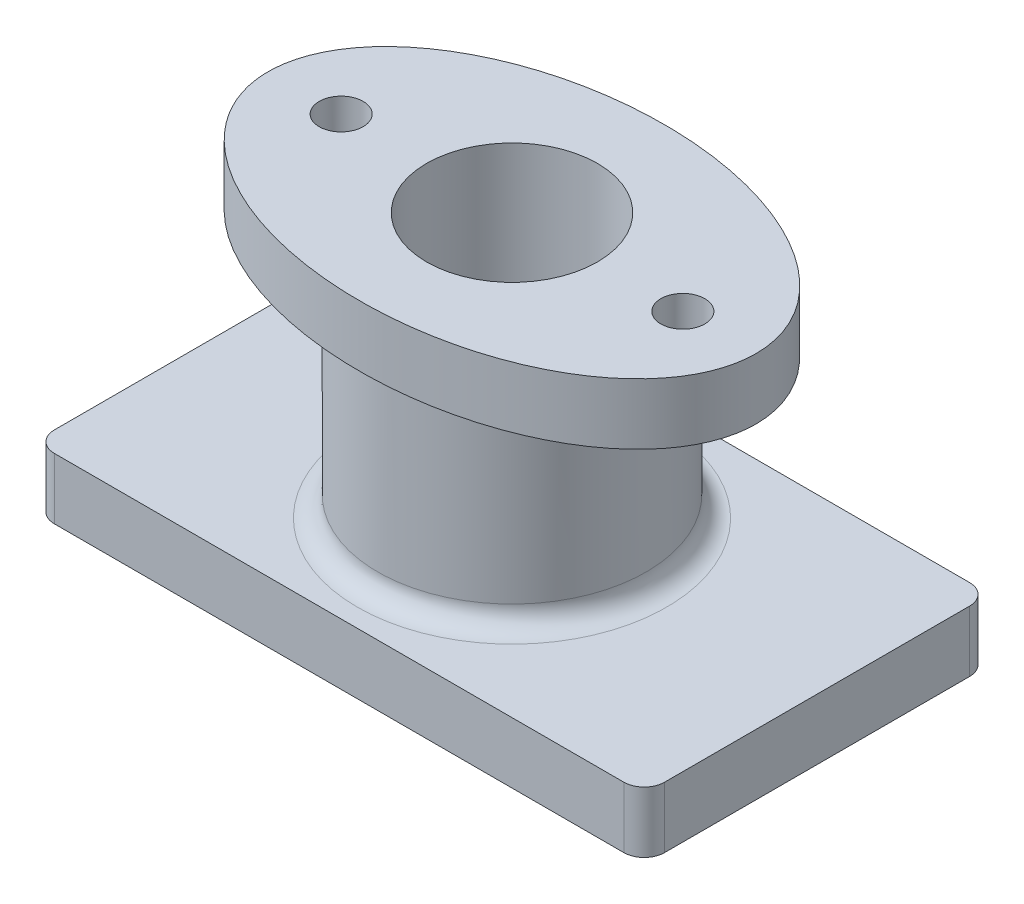
ISO-10303-21;
HEADER;
FILE_DESCRIPTION(('STEP AP214'),'2;1');
FILE_NAME('part.step','',(''),(''),'','','');
FILE_SCHEMA(('AUTOMOTIVE_DESIGN { 1 0 10303 214 1 1 1 1 }'));
ENDSEC;
DATA;
#1=APPLICATION_CONTEXT('core data for automotive mechanical design processes');
#2=APPLICATION_PROTOCOL_DEFINITION('international standard','automotive_design',2000,#1);
#3=PRODUCT_CONTEXT('',#1,'mechanical');
#4=PRODUCT('Part','Part','',(#3));
#5=PRODUCT_RELATED_PRODUCT_CATEGORY('part','',(#4));
#6=PRODUCT_DEFINITION_FORMATION('','',#4);
#7=PRODUCT_DEFINITION_CONTEXT('part definition',#1,'design');
#8=PRODUCT_DEFINITION('design','',#6,#7);
#9=PRODUCT_DEFINITION_SHAPE('','',#8);
#10=(LENGTH_UNIT() NAMED_UNIT(*) SI_UNIT(.MILLI.,.METRE.));
#11=(NAMED_UNIT(*) PLANE_ANGLE_UNIT() SI_UNIT($,.RADIAN.));
#12=(NAMED_UNIT(*) SI_UNIT($,.STERADIAN.) SOLID_ANGLE_UNIT());
#13=UNCERTAINTY_MEASURE_WITH_UNIT(LENGTH_MEASURE(1.E-05),#10,'distance_accuracy_value','');
#14=(GEOMETRIC_REPRESENTATION_CONTEXT(3) GLOBAL_UNCERTAINTY_ASSIGNED_CONTEXT((#13)) GLOBAL_UNIT_ASSIGNED_CONTEXT((#10,
#11,#12)) REPRESENTATION_CONTEXT('',''));
#15=CARTESIAN_POINT('',(0.,0.,0.));
#16=DIRECTION('',(0.,0.,1.));
#17=DIRECTION('',(1.,0.,0.));
#18=AXIS2_PLACEMENT_3D('',#15,#16,#17);
#19=CARTESIAN_POINT('',(-70.,15.,37.5));
#20=DIRECTION('',(0.,-1.,0.));
#21=DIRECTION('',(0.,0.,-1.));
#22=AXIS2_PLACEMENT_3D('',#19,#20,#21);
#23=CYLINDRICAL_SURFACE('',#22,5.);
#24=CARTESIAN_POINT('',(-70.,0.,37.5));
#25=DIRECTION('',(0.,1.,0.));
#26=DIRECTION('',(0.,0.,-1.));
#27=AXIS2_PLACEMENT_3D('',#24,#25,#26);
#28=CIRCLE('',#27,5.);
#29=CARTESIAN_POINT('',(-75.,0.,37.5));
#30=VERTEX_POINT('',#29);
#31=CARTESIAN_POINT('',(-70.,0.,42.5));
#32=VERTEX_POINT('',#31);
#33=EDGE_CURVE('E133',#30,#32,#28,.T.);
#34=ORIENTED_EDGE('',*,*,#33,.T.);
#35=DIRECTION('',(0.,-1.,0.));
#36=VECTOR('',#35,1.);
#37=CARTESIAN_POINT('',(-70.,15.,42.5));
#38=LINE('',#37,#36);
#39=CARTESIAN_POINT('',(-70.,15.,42.5));
#40=VERTEX_POINT('',#39);
#41=EDGE_CURVE('E161',#40,#32,#38,.T.);
#42=ORIENTED_EDGE('',*,*,#41,.F.);
#43=CARTESIAN_POINT('',(-70.,15.,37.5));
#44=DIRECTION('',(0.,1.,0.));
#45=DIRECTION('',(0.,0.,-1.));
#46=AXIS2_PLACEMENT_3D('',#43,#44,#45);
#47=CIRCLE('',#46,5.);
#48=CARTESIAN_POINT('',(-75.,15.,37.5));
#49=VERTEX_POINT('',#48);
#50=EDGE_CURVE('E148',#49,#40,#47,.T.);
#51=ORIENTED_EDGE('',*,*,#50,.F.);
#52=DIRECTION('',(0.,-1.,0.));
#53=VECTOR('',#52,1.);
#54=CARTESIAN_POINT('',(-75.,15.,37.5));
#55=LINE('',#54,#53);
#56=EDGE_CURVE('E129',#49,#30,#55,.T.);
#57=ORIENTED_EDGE('',*,*,#56,.T.);
#58=EDGE_LOOP('',(#34,#42,#51,#57));
#59=FACE_BOUND('',#58,.T.);
#60=ADVANCED_FACE('F35',(#59),#23,.T.);
#61=CARTESIAN_POINT('',(-70.,15.,42.5));
#62=DIRECTION('',(0.,0.,-1.));
#63=DIRECTION('',(-1.,0.,0.));
#64=AXIS2_PLACEMENT_3D('',#61,#62,#63);
#65=PLANE('',#64);
#66=DIRECTION('',(1.,0.,0.));
#67=VECTOR('',#66,1.);
#68=CARTESIAN_POINT('',(-70.,0.,42.5));
#69=LINE('',#68,#67);
#70=CARTESIAN_POINT('',(70.,0.,42.5));
#71=VERTEX_POINT('',#70);
#72=EDGE_CURVE('E136',#32,#71,#69,.T.);
#73=ORIENTED_EDGE('',*,*,#72,.T.);
#74=DIRECTION('',(0.,-1.,0.));
#75=VECTOR('',#74,1.);
#76=CARTESIAN_POINT('',(70.,15.,42.5));
#77=LINE('',#76,#75);
#78=CARTESIAN_POINT('',(70.,15.,42.5));
#79=VERTEX_POINT('',#78);
#80=EDGE_CURVE('E158',#79,#71,#77,.T.);
#81=ORIENTED_EDGE('',*,*,#80,.F.);
#82=DIRECTION('',(1.,0.,0.));
#83=VECTOR('',#82,1.);
#84=CARTESIAN_POINT('',(-70.,15.,42.5));
#85=LINE('',#84,#83);
#86=EDGE_CURVE('E96',#40,#79,#85,.T.);
#87=ORIENTED_EDGE('',*,*,#86,.F.);
#88=ORIENTED_EDGE('',*,*,#41,.T.);
#89=EDGE_LOOP('',(#73,#81,#87,#88));
#90=FACE_BOUND('',#89,.T.);
#91=ADVANCED_FACE('F179',(#90),#65,.F.);
#92=CARTESIAN_POINT('',(70.,15.,37.5));
#93=DIRECTION('',(0.,-1.,0.));
#94=DIRECTION('',(0.,0.,-1.));
#95=AXIS2_PLACEMENT_3D('',#92,#93,#94);
#96=CYLINDRICAL_SURFACE('',#95,5.);
#97=CARTESIAN_POINT('',(70.,0.,37.5));
#98=DIRECTION('',(0.,1.,0.));
#99=DIRECTION('',(0.,0.,1.));
#100=AXIS2_PLACEMENT_3D('',#97,#98,#99);
#101=CIRCLE('',#100,5.);
#102=CARTESIAN_POINT('',(75.,0.,37.5));
#103=VERTEX_POINT('',#102);
#104=EDGE_CURVE('E139',#71,#103,#101,.T.);
#105=ORIENTED_EDGE('',*,*,#104,.T.);
#106=DIRECTION('',(0.,-1.,0.));
#107=VECTOR('',#106,1.);
#108=CARTESIAN_POINT('',(75.,15.,37.5));
#109=LINE('',#108,#107);
#110=CARTESIAN_POINT('',(75.,15.,37.5));
#111=VERTEX_POINT('',#110);
#112=EDGE_CURVE('E155',#111,#103,#109,.T.);
#113=ORIENTED_EDGE('',*,*,#112,.F.);
#114=CARTESIAN_POINT('',(70.,15.,37.5));
#115=DIRECTION('',(0.,1.,0.));
#116=DIRECTION('',(0.,0.,1.));
#117=AXIS2_PLACEMENT_3D('',#114,#115,#116);
#118=CIRCLE('',#117,5.);
#119=EDGE_CURVE('E237',#79,#111,#118,.T.);
#120=ORIENTED_EDGE('',*,*,#119,.F.);
#121=ORIENTED_EDGE('',*,*,#80,.T.);
#122=EDGE_LOOP('',(#105,#113,#120,#121));
#123=FACE_BOUND('',#122,.T.);
#124=ADVANCED_FACE('F184',(#123),#96,.T.);
#125=CARTESIAN_POINT('',(75.,15.,37.5));
#126=DIRECTION('',(-1.,0.,0.));
#127=DIRECTION('',(0.,0.,1.));
#128=AXIS2_PLACEMENT_3D('',#125,#126,#127);
#129=PLANE('',#128);
#130=DIRECTION('',(0.,0.,-1.));
#131=VECTOR('',#130,1.);
#132=CARTESIAN_POINT('',(75.,0.,37.5));
#133=LINE('',#132,#131);
#134=CARTESIAN_POINT('',(75.,0.,-37.5));
#135=VERTEX_POINT('',#134);
#136=EDGE_CURVE('E141',#103,#135,#133,.T.);
#137=ORIENTED_EDGE('',*,*,#136,.T.);
#138=DIRECTION('',(0.,-1.,0.));
#139=VECTOR('',#138,1.);
#140=CARTESIAN_POINT('',(75.,15.,-37.5));
#141=LINE('',#140,#139);
#142=CARTESIAN_POINT('',(75.,15.,-37.5));
#143=VERTEX_POINT('',#142);
#144=EDGE_CURVE('E152',#143,#135,#141,.T.);
#145=ORIENTED_EDGE('',*,*,#144,.F.);
#146=DIRECTION('',(0.,0.,-1.));
#147=VECTOR('',#146,1.);
#148=CARTESIAN_POINT('',(75.,15.,37.5));
#149=LINE('',#148,#147);
#150=EDGE_CURVE('E239',#111,#143,#149,.T.);
#151=ORIENTED_EDGE('',*,*,#150,.F.);
#152=ORIENTED_EDGE('',*,*,#112,.T.);
#153=EDGE_LOOP('',(#137,#145,#151,#152));
#154=FACE_BOUND('',#153,.T.);
#155=ADVANCED_FACE('F189',(#154),#129,.F.);
#156=CARTESIAN_POINT('',(70.,15.,-37.5));
#157=DIRECTION('',(0.,-1.,0.));
#158=DIRECTION('',(0.,0.,-1.));
#159=AXIS2_PLACEMENT_3D('',#156,#157,#158);
#160=CYLINDRICAL_SURFACE('',#159,5.);
#161=CARTESIAN_POINT('',(70.,0.,-37.5));
#162=DIRECTION('',(0.,1.,0.));
#163=DIRECTION('',(0.,0.,-1.));
#164=AXIS2_PLACEMENT_3D('',#161,#162,#163);
#165=CIRCLE('',#164,5.);
#166=CARTESIAN_POINT('',(70.,0.,-42.5));
#167=VERTEX_POINT('',#166);
#168=EDGE_CURVE('E143',#135,#167,#165,.T.);
#169=ORIENTED_EDGE('',*,*,#168,.T.);
#170=DIRECTION('',(0.,-1.,0.));
#171=VECTOR('',#170,1.);
#172=CARTESIAN_POINT('',(70.,15.,-42.5));
#173=LINE('',#172,#171);
#174=CARTESIAN_POINT('',(70.,15.,-42.5));
#175=VERTEX_POINT('',#174);
#176=EDGE_CURVE('E124',#175,#167,#173,.T.);
#177=ORIENTED_EDGE('',*,*,#176,.F.);
#178=CARTESIAN_POINT('',(70.,15.,-37.5));
#179=DIRECTION('',(0.,1.,0.));
#180=DIRECTION('',(0.,0.,-1.));
#181=AXIS2_PLACEMENT_3D('',#178,#179,#180);
#182=CIRCLE('',#181,5.);
#183=EDGE_CURVE('E115',#143,#175,#182,.T.);
#184=ORIENTED_EDGE('',*,*,#183,.F.);
#185=ORIENTED_EDGE('',*,*,#144,.T.);
#186=EDGE_LOOP('',(#169,#177,#184,#185));
#187=FACE_BOUND('',#186,.T.);
#188=ADVANCED_FACE('F193',(#187),#160,.T.);
#189=CARTESIAN_POINT('',(-70.,15.,-42.5));
#190=DIRECTION('',(0.,0.,1.));
#191=DIRECTION('',(1.,0.,0.));
#192=AXIS2_PLACEMENT_3D('',#189,#190,#191);
#193=PLANE('',#192);
#194=DIRECTION('',(-1.,0.,0.));
#195=VECTOR('',#194,1.);
#196=CARTESIAN_POINT('',(-70.,0.,-42.5));
#197=LINE('',#196,#195);
#198=CARTESIAN_POINT('',(-70.,0.,-42.5));
#199=VERTEX_POINT('',#198);
#200=EDGE_CURVE('E123',#167,#199,#197,.T.);
#201=ORIENTED_EDGE('',*,*,#200,.T.);
#202=DIRECTION('',(0.,-1.,0.));
#203=VECTOR('',#202,1.);
#204=CARTESIAN_POINT('',(-70.,15.,-42.5));
#205=LINE('',#204,#203);
#206=CARTESIAN_POINT('',(-70.,15.,-42.5));
#207=VERTEX_POINT('',#206);
#208=EDGE_CURVE('E120',#207,#199,#205,.T.);
#209=ORIENTED_EDGE('',*,*,#208,.F.);
#210=DIRECTION('',(-1.,0.,0.));
#211=VECTOR('',#210,1.);
#212=CARTESIAN_POINT('',(-70.,15.,-42.5));
#213=LINE('',#212,#211);
#214=EDGE_CURVE('E109',#175,#207,#213,.T.);
#215=ORIENTED_EDGE('',*,*,#214,.F.);
#216=ORIENTED_EDGE('',*,*,#176,.T.);
#217=EDGE_LOOP('',(#201,#209,#215,#216));
#218=FACE_BOUND('',#217,.T.);
#219=ADVANCED_FACE('F121',(#218),#193,.F.);
#220=CARTESIAN_POINT('',(-70.,15.,-37.5));
#221=DIRECTION('',(0.,-1.,0.));
#222=DIRECTION('',(0.,0.,-1.));
#223=AXIS2_PLACEMENT_3D('',#220,#221,#222);
#224=CYLINDRICAL_SURFACE('',#223,5.);
#225=CARTESIAN_POINT('',(-70.,0.,-37.5));
#226=DIRECTION('',(0.,1.,0.));
#227=DIRECTION('',(0.,0.,-1.));
#228=AXIS2_PLACEMENT_3D('',#225,#226,#227);
#229=CIRCLE('',#228,5.);
#230=CARTESIAN_POINT('',(-75.,0.,-37.5));
#231=VERTEX_POINT('',#230);
#232=EDGE_CURVE('E81',#199,#231,#229,.T.);
#233=ORIENTED_EDGE('',*,*,#232,.T.);
#234=DIRECTION('',(0.,-1.,0.));
#235=VECTOR('',#234,1.);
#236=CARTESIAN_POINT('',(-75.,15.,-37.5));
#237=LINE('',#236,#235);
#238=CARTESIAN_POINT('',(-75.,15.,-37.5));
#239=VERTEX_POINT('',#238);
#240=EDGE_CURVE('E125',#239,#231,#237,.T.);
#241=ORIENTED_EDGE('',*,*,#240,.F.);
#242=CARTESIAN_POINT('',(-70.,15.,-37.5));
#243=DIRECTION('',(0.,1.,0.));
#244=DIRECTION('',(0.,0.,-1.));
#245=AXIS2_PLACEMENT_3D('',#242,#243,#244);
#246=CIRCLE('',#245,5.);
#247=EDGE_CURVE('E113',#207,#239,#246,.T.);
#248=ORIENTED_EDGE('',*,*,#247,.F.);
#249=ORIENTED_EDGE('',*,*,#208,.T.);
#250=EDGE_LOOP('',(#233,#241,#248,#249));
#251=FACE_BOUND('',#250,.T.);
#252=ADVANCED_FACE('F127',(#251),#224,.T.);
#253=CARTESIAN_POINT('',(-75.,15.,37.5));
#254=DIRECTION('',(1.,0.,0.));
#255=DIRECTION('',(0.,0.,-1.));
#256=AXIS2_PLACEMENT_3D('',#253,#254,#255);
#257=PLANE('',#256);
#258=DIRECTION('',(0.,0.,1.));
#259=VECTOR('',#258,1.);
#260=CARTESIAN_POINT('',(-75.,0.,37.5));
#261=LINE('',#260,#259);
#262=EDGE_CURVE('E87',#231,#30,#261,.T.);
#263=ORIENTED_EDGE('',*,*,#262,.T.);
#264=ORIENTED_EDGE('',*,*,#56,.F.);
#265=DIRECTION('',(0.,0.,1.));
#266=VECTOR('',#265,1.);
#267=CARTESIAN_POINT('',(-75.,15.,37.5));
#268=LINE('',#267,#266);
#269=EDGE_CURVE('E52',#239,#49,#268,.T.);
#270=ORIENTED_EDGE('',*,*,#269,.F.);
#271=ORIENTED_EDGE('',*,*,#240,.T.);
#272=EDGE_LOOP('',(#263,#264,#270,#271));
#273=FACE_BOUND('',#272,.T.);
#274=ADVANCED_FACE('F202',(#273),#257,.F.);
#275=CARTESIAN_POINT('',(-70.,15.,37.5));
#276=DIRECTION('',(0.,-1.,0.));
#277=DIRECTION('',(0.,0.,-1.));
#278=AXIS2_PLACEMENT_3D('',#275,#276,#277);
#279=PLANE('',#278);
#280=CARTESIAN_POINT('',(0.,15.,0.));
#281=DIRECTION('',(0.,-1.,0.));
#282=DIRECTION('',(0.,0.,-1.));
#283=AXIS2_PLACEMENT_3D('',#280,#281,#282);
#284=CIRCLE('',#283,38.);
#285=CARTESIAN_POINT('',(0.,15.,-38.));
#286=VERTEX_POINT('',#285);
#287=EDGE_CURVE('E11',#286,#286,#284,.T.);
#288=ORIENTED_EDGE('',*,*,#287,.T.);
#289=EDGE_LOOP('',(#288));
#290=FACE_BOUND('',#289,.T.);
#291=ORIENTED_EDGE('',*,*,#50,.T.);
#292=ORIENTED_EDGE('',*,*,#86,.T.);
#293=ORIENTED_EDGE('',*,*,#119,.T.);
#294=ORIENTED_EDGE('',*,*,#150,.T.);
#295=ORIENTED_EDGE('',*,*,#183,.T.);
#296=ORIENTED_EDGE('',*,*,#214,.T.);
#297=ORIENTED_EDGE('',*,*,#247,.T.);
#298=ORIENTED_EDGE('',*,*,#269,.T.);
#299=EDGE_LOOP('',(#291,#292,#293,#294,#295,#296,#297,#298));
#300=FACE_BOUND('',#299,.T.);
#301=ADVANCED_FACE('F111',(#290,#300),#279,.F.);
#302=CARTESIAN_POINT('',(-70.,0.,37.5));
#303=DIRECTION('',(0.,-1.,0.));
#304=DIRECTION('',(0.,0.,-1.));
#305=AXIS2_PLACEMENT_3D('',#302,#303,#304);
#306=PLANE('',#305);
#307=CARTESIAN_POINT('',(0.,0.,0.));
#308=DIRECTION('',(0.,-1.,0.));
#309=DIRECTION('',(0.,0.,-1.));
#310=AXIS2_PLACEMENT_3D('',#307,#308,#309);
#311=CIRCLE('',#310,16.5);
#312=CARTESIAN_POINT('',(0.,0.,-16.5));
#313=VERTEX_POINT('',#312);
#314=EDGE_CURVE('E284',#313,#313,#311,.T.);
#315=ORIENTED_EDGE('',*,*,#314,.F.);
#316=EDGE_LOOP('',(#315));
#317=FACE_BOUND('',#316,.T.);
#318=ORIENTED_EDGE('',*,*,#33,.F.);
#319=ORIENTED_EDGE('',*,*,#262,.F.);
#320=ORIENTED_EDGE('',*,*,#232,.F.);
#321=ORIENTED_EDGE('',*,*,#200,.F.);
#322=ORIENTED_EDGE('',*,*,#168,.F.);
#323=ORIENTED_EDGE('',*,*,#136,.F.);
#324=ORIENTED_EDGE('',*,*,#104,.F.);
#325=ORIENTED_EDGE('',*,*,#72,.F.);
#326=EDGE_LOOP('',(#318,#319,#320,#321,#322,#323,#324,#325));
#327=FACE_BOUND('',#326,.T.);
#328=ADVANCED_FACE('F205',(#317,#327),#306,.T.);
#329=CARTESIAN_POINT('',(0.,65.,0.));
#330=DIRECTION('',(0.,-1.,0.));
#331=DIRECTION('',(0.,0.,-1.));
#332=AXIS2_PLACEMENT_3D('',#329,#330,#331);
#333=CYLINDRICAL_SURFACE('',#332,33.);
#334=CARTESIAN_POINT('',(0.,20.,0.));
#335=DIRECTION('',(0.,-1.,0.));
#336=DIRECTION('',(0.,0.,-1.));
#337=AXIS2_PLACEMENT_3D('',#334,#335,#336);
#338=CIRCLE('',#337,33.);
#339=CARTESIAN_POINT('',(0.,20.,-33.));
#340=VERTEX_POINT('',#339);
#341=EDGE_CURVE('E44',#340,#340,#338,.F.);
#342=ORIENTED_EDGE('',*,*,#341,.T.);
#343=EDGE_LOOP('',(#342));
#344=FACE_BOUND('',#343,.T.);
#345=CARTESIAN_POINT('',(0.,65.,0.));
#346=DIRECTION('',(0.,1.,0.));
#347=DIRECTION('',(0.,0.,1.));
#348=AXIS2_PLACEMENT_3D('',#345,#346,#347);
#349=CIRCLE('',#348,33.);
#350=CARTESIAN_POINT('',(0.,65.,33.));
#351=VERTEX_POINT('',#350);
#352=EDGE_CURVE('E137',#351,#351,#349,.T.);
#353=ORIENTED_EDGE('',*,*,#352,.F.);
#354=EDGE_LOOP('',(#353));
#355=FACE_BOUND('',#354,.T.);
#356=ADVANCED_FACE('F165',(#344,#355),#333,.T.);
#357=CARTESIAN_POINT('',(0.,80.,0.));
#358=DIRECTION('',(0.,1.,0.));
#359=DIRECTION('',(1.,0.,0.));
#360=AXIS2_PLACEMENT_3D('',#357,#358,#359);
#361=ELLIPSE('',#360,60.,37.5);
#362=DIRECTION('',(0.,-1.,0.));
#363=VECTOR('',#362,1.);
#364=SURFACE_OF_LINEAR_EXTRUSION('',#361,#363);
#365=CARTESIAN_POINT('',(60.,80.,0.));
#366=VERTEX_POINT('',#365);
#367=EDGE_CURVE('E222',#366,#366,#361,.T.);
#368=ORIENTED_EDGE('',*,*,#367,.F.);
#369=EDGE_LOOP('',(#368));
#370=FACE_BOUND('',#369,.T.);
#371=CARTESIAN_POINT('',(0.,65.,0.));
#372=DIRECTION('',(0.,1.,0.));
#373=DIRECTION('',(1.,0.,0.));
#374=AXIS2_PLACEMENT_3D('',#371,#372,#373);
#375=ELLIPSE('',#374,60.,37.5);
#376=CARTESIAN_POINT('',(60.,65.,0.));
#377=VERTEX_POINT('',#376);
#378=EDGE_CURVE('E227',#377,#377,#375,.T.);
#379=ORIENTED_EDGE('',*,*,#378,.T.);
#380=EDGE_LOOP('',(#379));
#381=FACE_BOUND('',#380,.T.);
#382=ADVANCED_FACE('F214',(#370,#381),#364,.F.);
#383=CARTESIAN_POINT('',(0.,80.,0.));
#384=DIRECTION('',(0.,1.,0.));
#385=DIRECTION('',(0.,0.,1.));
#386=AXIS2_PLACEMENT_3D('',#383,#384,#385);
#387=PLANE('',#386);
#388=CARTESIAN_POINT('',(42.,80.,0.));
#389=DIRECTION('',(0.,1.,0.));
#390=DIRECTION('',(0.,0.,1.));
#391=AXIS2_PLACEMENT_3D('',#388,#389,#390);
#392=CIRCLE('',#391,5.4);
#393=CARTESIAN_POINT('',(42.,80.,5.4));
#394=VERTEX_POINT('',#393);
#395=EDGE_CURVE('E275',#394,#394,#392,.T.);
#396=ORIENTED_EDGE('',*,*,#395,.F.);
#397=EDGE_LOOP('',(#396));
#398=FACE_BOUND('',#397,.T.);
#399=CARTESIAN_POINT('',(-42.,80.,0.));
#400=DIRECTION('',(0.,1.,0.));
#401=DIRECTION('',(0.,0.,-1.));
#402=AXIS2_PLACEMENT_3D('',#399,#400,#401);
#403=CIRCLE('',#402,5.4);
#404=CARTESIAN_POINT('',(-42.,80.,-5.4));
#405=VERTEX_POINT('',#404);
#406=EDGE_CURVE('E276',#405,#405,#403,.T.);
#407=ORIENTED_EDGE('',*,*,#406,.F.);
#408=EDGE_LOOP('',(#407));
#409=FACE_BOUND('',#408,.T.);
#410=CARTESIAN_POINT('',(0.,80.,0.));
#411=DIRECTION('',(0.,1.,0.));
#412=DIRECTION('',(0.,0.,1.));
#413=AXIS2_PLACEMENT_3D('',#410,#411,#412);
#414=CIRCLE('',#413,21.);
#415=CARTESIAN_POINT('',(0.,80.,21.));
#416=VERTEX_POINT('',#415);
#417=EDGE_CURVE('E228',#416,#416,#414,.T.);
#418=ORIENTED_EDGE('',*,*,#417,.F.);
#419=EDGE_LOOP('',(#418));
#420=FACE_BOUND('',#419,.T.);
#421=ORIENTED_EDGE('',*,*,#367,.T.);
#422=EDGE_LOOP('',(#421));
#423=FACE_BOUND('',#422,.T.);
#424=ADVANCED_FACE('F218',(#398,#409,#420,#423),#387,.T.);
#425=CARTESIAN_POINT('',(0.,65.,0.));
#426=DIRECTION('',(0.,1.,0.));
#427=DIRECTION('',(0.,0.,1.));
#428=AXIS2_PLACEMENT_3D('',#425,#426,#427);
#429=PLANE('',#428);
#430=CARTESIAN_POINT('',(42.,65.,0.));
#431=DIRECTION('',(0.,1.,0.));
#432=DIRECTION('',(0.,0.,1.));
#433=AXIS2_PLACEMENT_3D('',#430,#431,#432);
#434=CIRCLE('',#433,5.4);
#435=CARTESIAN_POINT('',(42.,65.,5.4));
#436=VERTEX_POINT('',#435);
#437=EDGE_CURVE('E270',#436,#436,#434,.F.);
#438=ORIENTED_EDGE('',*,*,#437,.F.);
#439=EDGE_LOOP('',(#438));
#440=FACE_BOUND('',#439,.T.);
#441=CARTESIAN_POINT('',(-42.,65.,0.));
#442=DIRECTION('',(0.,1.,0.));
#443=DIRECTION('',(0.,0.,1.));
#444=AXIS2_PLACEMENT_3D('',#441,#442,#443);
#445=CIRCLE('',#444,5.4);
#446=CARTESIAN_POINT('',(-42.,65.,5.4));
#447=VERTEX_POINT('',#446);
#448=EDGE_CURVE('E273',#447,#447,#445,.F.);
#449=ORIENTED_EDGE('',*,*,#448,.F.);
#450=EDGE_LOOP('',(#449));
#451=FACE_BOUND('',#450,.T.);
#452=ORIENTED_EDGE('',*,*,#352,.T.);
#453=EDGE_LOOP('',(#452));
#454=FACE_BOUND('',#453,.T.);
#455=ORIENTED_EDGE('',*,*,#378,.F.);
#456=EDGE_LOOP('',(#455));
#457=FACE_BOUND('',#456,.T.);
#458=ADVANCED_FACE('F220',(#440,#451,#454,#457),#429,.F.);
#459=CARTESIAN_POINT('',(0.,15.,0.));
#460=DIRECTION('',(0.,1.,0.));
#461=DIRECTION('',(0.,0.,1.));
#462=AXIS2_PLACEMENT_3D('',#459,#460,#461);
#463=CYLINDRICAL_SURFACE('',#462,21.);
#464=CARTESIAN_POINT('',(0.,15.,0.));
#465=DIRECTION('',(0.,1.,0.));
#466=DIRECTION('',(0.,0.,1.));
#467=AXIS2_PLACEMENT_3D('',#464,#465,#466);
#468=CIRCLE('',#467,21.);
#469=CARTESIAN_POINT('',(0.,15.,21.));
#470=VERTEX_POINT('',#469);
#471=EDGE_CURVE('E232',#470,#470,#468,.T.);
#472=ORIENTED_EDGE('',*,*,#471,.F.);
#473=EDGE_LOOP('',(#472));
#474=FACE_BOUND('',#473,.T.);
#475=ORIENTED_EDGE('',*,*,#417,.T.);
#476=EDGE_LOOP('',(#475));
#477=FACE_BOUND('',#476,.T.);
#478=ADVANCED_FACE('F255',(#474,#477),#463,.F.);
#479=CARTESIAN_POINT('',(0.,15.,0.));
#480=DIRECTION('',(0.,1.,0.));
#481=DIRECTION('',(0.,0.,1.));
#482=AXIS2_PLACEMENT_3D('',#479,#480,#481);
#483=PLANE('',#482);
#484=CARTESIAN_POINT('',(0.,15.,0.));
#485=DIRECTION('',(0.,1.,0.));
#486=DIRECTION('',(0.,0.,1.));
#487=AXIS2_PLACEMENT_3D('',#484,#485,#486);
#488=CIRCLE('',#487,16.5);
#489=CARTESIAN_POINT('',(0.,15.,16.5));
#490=VERTEX_POINT('',#489);
#491=EDGE_CURVE('E287',#490,#490,#488,.F.);
#492=ORIENTED_EDGE('',*,*,#491,.T.);
#493=EDGE_LOOP('',(#492));
#494=FACE_BOUND('',#493,.T.);
#495=ORIENTED_EDGE('',*,*,#471,.T.);
#496=EDGE_LOOP('',(#495));
#497=FACE_BOUND('',#496,.T.);
#498=ADVANCED_FACE('F263',(#494,#497),#483,.T.);
#499=CARTESIAN_POINT('',(0.,80.001,0.));
#500=DIRECTION('',(0.,-1.,0.));
#501=DIRECTION('',(0.,0.,-1.));
#502=AXIS2_PLACEMENT_3D('',#499,#500,#501);
#503=CYLINDRICAL_SURFACE('',#502,16.5);
#504=ORIENTED_EDGE('',*,*,#491,.F.);
#505=EDGE_LOOP('',(#504));
#506=FACE_BOUND('',#505,.T.);
#507=ORIENTED_EDGE('',*,*,#314,.T.);
#508=EDGE_LOOP('',(#507));
#509=FACE_BOUND('',#508,.T.);
#510=ADVANCED_FACE('F299',(#506,#509),#503,.F.);
#511=CARTESIAN_POINT('',(-42.,-0.001000000000001,0.));
#512=DIRECTION('',(0.,1.,0.));
#513=DIRECTION('',(0.,0.,1.));
#514=AXIS2_PLACEMENT_3D('',#511,#512,#513);
#515=CYLINDRICAL_SURFACE('',#514,5.4);
#516=ORIENTED_EDGE('',*,*,#406,.T.);
#517=EDGE_LOOP('',(#516));
#518=FACE_BOUND('',#517,.T.);
#519=ORIENTED_EDGE('',*,*,#448,.T.);
#520=EDGE_LOOP('',(#519));
#521=FACE_BOUND('',#520,.T.);
#522=ADVANCED_FACE('F174',(#518,#521),#515,.F.);
#523=CARTESIAN_POINT('',(42.,-0.001000000000001,0.));
#524=DIRECTION('',(0.,1.,0.));
#525=DIRECTION('',(0.,0.,1.));
#526=AXIS2_PLACEMENT_3D('',#523,#524,#525);
#527=CYLINDRICAL_SURFACE('',#526,5.4);
#528=ORIENTED_EDGE('',*,*,#395,.T.);
#529=EDGE_LOOP('',(#528));
#530=FACE_BOUND('',#529,.T.);
#531=ORIENTED_EDGE('',*,*,#437,.T.);
#532=EDGE_LOOP('',(#531));
#533=FACE_BOUND('',#532,.T.);
#534=ADVANCED_FACE('F169',(#530,#533),#527,.F.);
#535=CARTESIAN_POINT('',(0.,20.,0.));
#536=DIRECTION('',(0.,-1.,0.));
#537=DIRECTION('',(0.,0.,-1.));
#538=AXIS2_PLACEMENT_3D('',#535,#536,#537);
#539=TOROIDAL_SURFACE('',#538,38.,5.);
#540=ORIENTED_EDGE('',*,*,#287,.F.);
#541=EDGE_LOOP('',(#540));
#542=FACE_BOUND('',#541,.T.);
#543=ORIENTED_EDGE('',*,*,#341,.F.);
#544=EDGE_LOOP('',(#543));
#545=FACE_BOUND('',#544,.T.);
#546=ADVANCED_FACE('F37',(#542,#545),#539,.F.);
#547=CLOSED_SHELL('',(#60,#91,#124,#155,#188,#219,#252,#274,#301,#328,#356,#382,#424,#458,#478,
#498,#510,#522,#534,#546));
#548=MANIFOLD_SOLID_BREP('B2',#547);
#549=ADVANCED_BREP_SHAPE_REPRESENTATION('',(#18,#548),#14);
#550=SHAPE_DEFINITION_REPRESENTATION(#9,#549);
ENDSEC;
END-ISO-10303-21;
